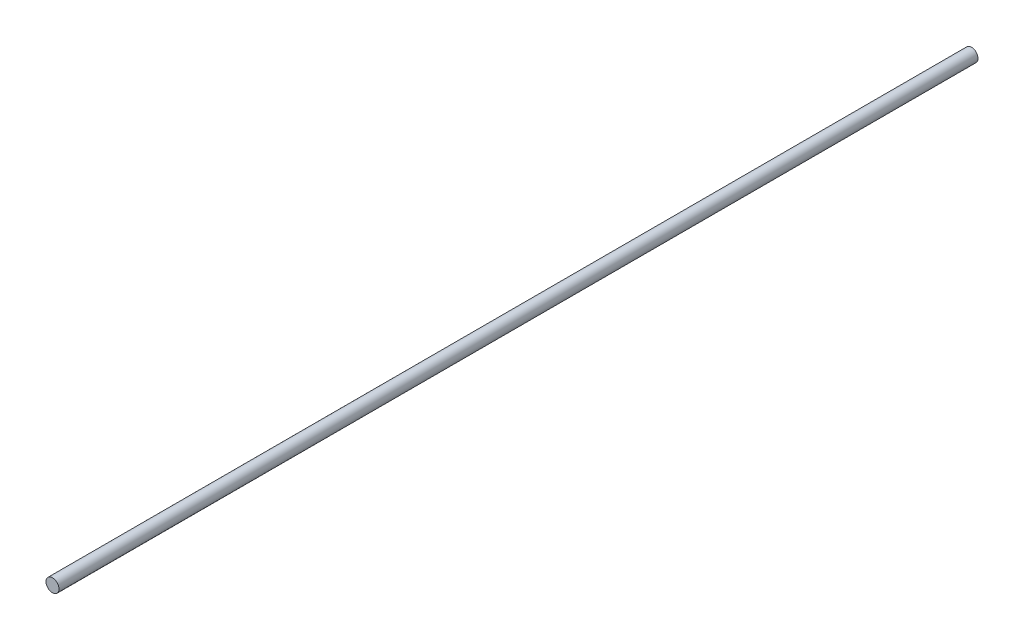
ISO-10303-21;
HEADER;
FILE_DESCRIPTION(('STEP AP214'),'2;1');
FILE_NAME('part.step','',(''),(''),'','','');
FILE_SCHEMA(('AUTOMOTIVE_DESIGN { 1 0 10303 214 1 1 1 1 }'));
ENDSEC;
DATA;
#1=APPLICATION_CONTEXT('core data for automotive mechanical design processes');
#2=APPLICATION_PROTOCOL_DEFINITION('international standard','automotive_design',2000,#1);
#3=PRODUCT_CONTEXT('',#1,'mechanical');
#4=PRODUCT('Part','Part','',(#3));
#5=PRODUCT_RELATED_PRODUCT_CATEGORY('part','',(#4));
#6=PRODUCT_DEFINITION_FORMATION('','',#4);
#7=PRODUCT_DEFINITION_CONTEXT('part definition',#1,'design');
#8=PRODUCT_DEFINITION('design','',#6,#7);
#9=PRODUCT_DEFINITION_SHAPE('','',#8);
#10=(LENGTH_UNIT() NAMED_UNIT(*) SI_UNIT(.MILLI.,.METRE.));
#11=(NAMED_UNIT(*) PLANE_ANGLE_UNIT() SI_UNIT($,.RADIAN.));
#12=(NAMED_UNIT(*) SI_UNIT($,.STERADIAN.) SOLID_ANGLE_UNIT());
#13=UNCERTAINTY_MEASURE_WITH_UNIT(LENGTH_MEASURE(1.E-05),#10,'distance_accuracy_value','');
#14=(GEOMETRIC_REPRESENTATION_CONTEXT(3) GLOBAL_UNCERTAINTY_ASSIGNED_CONTEXT((#13)) GLOBAL_UNIT_ASSIGNED_CONTEXT((#10,
#11,#12)) REPRESENTATION_CONTEXT('',''));
#15=CARTESIAN_POINT('',(0.,0.,0.));
#16=DIRECTION('',(0.,0.,1.));
#17=DIRECTION('',(1.,0.,0.));
#18=AXIS2_PLACEMENT_3D('',#15,#16,#17);
#19=CARTESIAN_POINT('',(0.,0.,212.));
#20=DIRECTION('',(0.,0.,-1.));
#21=DIRECTION('',(-1.,0.,0.));
#22=AXIS2_PLACEMENT_3D('',#19,#20,#21);
#23=CYLINDRICAL_SURFACE('',#22,1.5);
#24=CARTESIAN_POINT('',(0.,0.,212.));
#25=DIRECTION('',(0.,0.,1.));
#26=DIRECTION('',(1.,0.,0.));
#27=AXIS2_PLACEMENT_3D('',#24,#25,#26);
#28=CIRCLE('',#27,1.5);
#29=CARTESIAN_POINT('',(1.5,0.,212.));
#30=VERTEX_POINT('',#29);
#31=EDGE_CURVE('E10',#30,#30,#28,.T.);
#32=ORIENTED_EDGE('',*,*,#31,.F.);
#33=EDGE_LOOP('',(#32));
#34=FACE_BOUND('',#33,.T.);
#35=CARTESIAN_POINT('',(0.,0.,0.));
#36=DIRECTION('',(0.,0.,1.));
#37=DIRECTION('',(1.,0.,0.));
#38=AXIS2_PLACEMENT_3D('',#35,#36,#37);
#39=CIRCLE('',#38,1.5);
#40=CARTESIAN_POINT('',(1.5,0.,0.));
#41=VERTEX_POINT('',#40);
#42=EDGE_CURVE('E42',#41,#41,#39,.T.);
#43=ORIENTED_EDGE('',*,*,#42,.T.);
#44=EDGE_LOOP('',(#43));
#45=FACE_BOUND('',#44,.T.);
#46=ADVANCED_FACE('F39',(#34,#45),#23,.T.);
#47=CARTESIAN_POINT('',(0.,0.,212.));
#48=DIRECTION('',(0.,0.,1.));
#49=DIRECTION('',(1.,0.,0.));
#50=AXIS2_PLACEMENT_3D('',#47,#48,#49);
#51=PLANE('',#50);
#52=ORIENTED_EDGE('',*,*,#31,.T.);
#53=EDGE_LOOP('',(#52));
#54=FACE_BOUND('',#53,.T.);
#55=ADVANCED_FACE('F54',(#54),#51,.T.);
#56=CARTESIAN_POINT('',(0.,0.,0.));
#57=DIRECTION('',(0.,0.,1.));
#58=DIRECTION('',(1.,0.,0.));
#59=AXIS2_PLACEMENT_3D('',#56,#57,#58);
#60=PLANE('',#59);
#61=ORIENTED_EDGE('',*,*,#42,.F.);
#62=EDGE_LOOP('',(#61));
#63=FACE_BOUND('',#62,.T.);
#64=ADVANCED_FACE('F52',(#63),#60,.F.);
#65=CLOSED_SHELL('',(#46,#55,#64));
#66=MANIFOLD_SOLID_BREP('B2',#65);
#67=ADVANCED_BREP_SHAPE_REPRESENTATION('',(#18,#66),#14);
#68=SHAPE_DEFINITION_REPRESENTATION(#9,#67);
ENDSEC;
END-ISO-10303-21;
